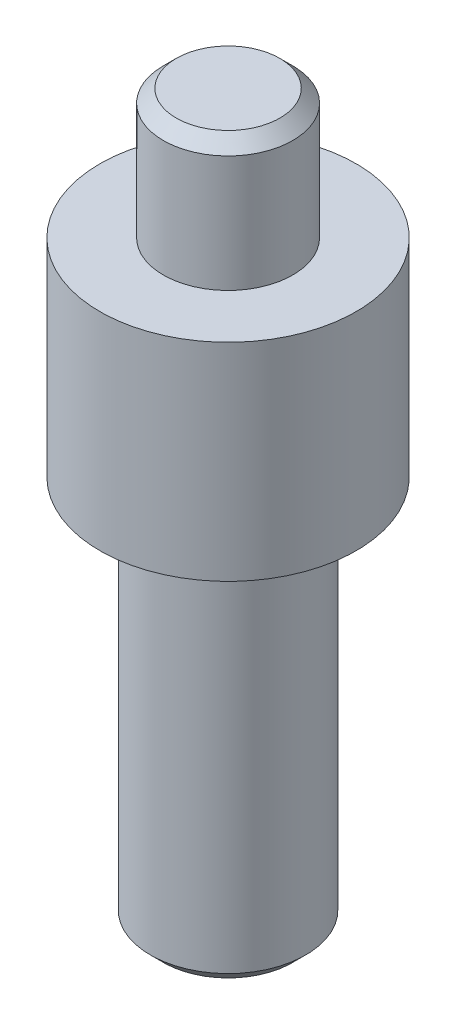
ISO-10303-21;
HEADER;
FILE_DESCRIPTION(('STEP AP214'),'2;1');
FILE_NAME('part.step','',(''),(''),'','','');
FILE_SCHEMA(('AUTOMOTIVE_DESIGN { 1 0 10303 214 1 1 1 1 }'));
ENDSEC;
DATA;
#1=APPLICATION_CONTEXT('core data for automotive mechanical design processes');
#2=APPLICATION_PROTOCOL_DEFINITION('international standard','automotive_design',2000,#1);
#3=PRODUCT_CONTEXT('',#1,'mechanical');
#4=PRODUCT('Part','Part','',(#3));
#5=PRODUCT_RELATED_PRODUCT_CATEGORY('part','',(#4));
#6=PRODUCT_DEFINITION_FORMATION('','',#4);
#7=PRODUCT_DEFINITION_CONTEXT('part definition',#1,'design');
#8=PRODUCT_DEFINITION('design','',#6,#7);
#9=PRODUCT_DEFINITION_SHAPE('','',#8);
#10=(LENGTH_UNIT() NAMED_UNIT(*) SI_UNIT(.MILLI.,.METRE.));
#11=(NAMED_UNIT(*) PLANE_ANGLE_UNIT() SI_UNIT($,.RADIAN.));
#12=(NAMED_UNIT(*) SI_UNIT($,.STERADIAN.) SOLID_ANGLE_UNIT());
#13=UNCERTAINTY_MEASURE_WITH_UNIT(LENGTH_MEASURE(1.E-05),#10,'distance_accuracy_value','');
#14=(GEOMETRIC_REPRESENTATION_CONTEXT(3) GLOBAL_UNCERTAINTY_ASSIGNED_CONTEXT((#13)) GLOBAL_UNIT_ASSIGNED_CONTEXT((#10,
#11,#12)) REPRESENTATION_CONTEXT('',''));
#15=CARTESIAN_POINT('',(0.,0.,0.));
#16=DIRECTION('',(0.,0.,1.));
#17=DIRECTION('',(1.,0.,0.));
#18=AXIS2_PLACEMENT_3D('',#15,#16,#17);
#19=CARTESIAN_POINT('',(0.,8.,0.));
#20=DIRECTION('',(0.,1.,0.));
#21=DIRECTION('',(-1.,0.,0.));
#22=AXIS2_PLACEMENT_3D('',#19,#20,#21);
#23=PLANE('',#22);
#24=CARTESIAN_POINT('',(0.,8.,0.));
#25=DIRECTION('',(0.,1.,0.));
#26=DIRECTION('',(-1.,0.,0.));
#27=AXIS2_PLACEMENT_3D('',#24,#25,#26);
#28=CIRCLE('',#27,4.95);
#29=CARTESIAN_POINT('',(-4.95,8.,0.));
#30=VERTEX_POINT('',#29);
#31=EDGE_CURVE('E58',#30,#30,#28,.T.);
#32=ORIENTED_EDGE('',*,*,#31,.T.);
#33=EDGE_LOOP('',(#32));
#34=FACE_BOUND('',#33,.T.);
#35=CARTESIAN_POINT('',(0.,8.,0.));
#36=DIRECTION('',(0.,1.,0.));
#37=DIRECTION('',(-1.,0.,0.));
#38=AXIS2_PLACEMENT_3D('',#35,#36,#37);
#39=CIRCLE('',#38,2.5);
#40=CARTESIAN_POINT('',(-2.50000000000001,8.,0.));
#41=VERTEX_POINT('',#40);
#42=EDGE_CURVE('E62',#41,#41,#39,.T.);
#43=ORIENTED_EDGE('',*,*,#42,.F.);
#44=EDGE_LOOP('',(#43));
#45=FACE_BOUND('',#44,.T.);
#46=ADVANCED_FACE('F35',(#34,#45),#23,.T.);
#47=CARTESIAN_POINT('',(0.,-15.,0.));
#48=DIRECTION('',(0.,1.,0.));
#49=DIRECTION('',(-1.,0.,0.));
#50=AXIS2_PLACEMENT_3D('',#47,#48,#49);
#51=CYLINDRICAL_SURFACE('',#50,3.);
#52=CARTESIAN_POINT('',(0.,-14.5,0.));
#53=DIRECTION('',(0.,1.,0.));
#54=DIRECTION('',(-1.,0.,0.));
#55=AXIS2_PLACEMENT_3D('',#52,#53,#54);
#56=CIRCLE('',#55,3.);
#57=CARTESIAN_POINT('',(-3.,-14.5,0.));
#58=VERTEX_POINT('',#57);
#59=EDGE_CURVE('E50',#58,#58,#56,.T.);
#60=ORIENTED_EDGE('',*,*,#59,.T.);
#61=EDGE_LOOP('',(#60));
#62=FACE_BOUND('',#61,.T.);
#63=CARTESIAN_POINT('',(0.,0.,0.));
#64=DIRECTION('',(0.,1.,0.));
#65=DIRECTION('',(-1.,0.,0.));
#66=AXIS2_PLACEMENT_3D('',#63,#64,#65);
#67=CIRCLE('',#66,3.);
#68=CARTESIAN_POINT('',(-3.,0.,0.));
#69=VERTEX_POINT('',#68);
#70=EDGE_CURVE('E55',#69,#69,#67,.T.);
#71=ORIENTED_EDGE('',*,*,#70,.F.);
#72=EDGE_LOOP('',(#71));
#73=FACE_BOUND('',#72,.T.);
#74=ADVANCED_FACE('F71',(#62,#73),#51,.T.);
#75=CARTESIAN_POINT('',(0.,-15.,0.));
#76=DIRECTION('',(0.,1.,0.));
#77=DIRECTION('',(-1.,0.,0.));
#78=AXIS2_PLACEMENT_3D('',#75,#76,#77);
#79=PLANE('',#78);
#80=CARTESIAN_POINT('',(0.,-15.,0.));
#81=DIRECTION('',(0.,1.,0.));
#82=DIRECTION('',(-1.,0.,0.));
#83=AXIS2_PLACEMENT_3D('',#80,#81,#82);
#84=CIRCLE('',#83,2.5);
#85=CARTESIAN_POINT('',(-2.5,-15.,0.));
#86=VERTEX_POINT('',#85);
#87=EDGE_CURVE('E46',#86,#86,#84,.F.);
#88=ORIENTED_EDGE('',*,*,#87,.T.);
#89=EDGE_LOOP('',(#88));
#90=FACE_BOUND('',#89,.T.);
#91=ADVANCED_FACE('F77',(#90),#79,.F.);
#92=CARTESIAN_POINT('',(0.,8.,0.));
#93=DIRECTION('',(0.,-1.,0.));
#94=DIRECTION('',(1.,0.,0.));
#95=AXIS2_PLACEMENT_3D('',#92,#93,#94);
#96=CYLINDRICAL_SURFACE('',#95,4.95);
#97=ORIENTED_EDGE('',*,*,#31,.F.);
#98=EDGE_LOOP('',(#97));
#99=FACE_BOUND('',#98,.T.);
#100=CARTESIAN_POINT('',(0.,0.,0.));
#101=DIRECTION('',(0.,1.,0.));
#102=DIRECTION('',(-1.,0.,0.));
#103=AXIS2_PLACEMENT_3D('',#100,#101,#102);
#104=CIRCLE('',#103,4.95);
#105=CARTESIAN_POINT('',(-4.95,0.,0.));
#106=VERTEX_POINT('',#105);
#107=EDGE_CURVE('E59',#106,#106,#104,.T.);
#108=ORIENTED_EDGE('',*,*,#107,.T.);
#109=EDGE_LOOP('',(#108));
#110=FACE_BOUND('',#109,.T.);
#111=ADVANCED_FACE('F87',(#99,#110),#96,.T.);
#112=CARTESIAN_POINT('',(0.,0.,0.));
#113=DIRECTION('',(0.,1.,0.));
#114=DIRECTION('',(-1.,0.,0.));
#115=AXIS2_PLACEMENT_3D('',#112,#113,#114);
#116=PLANE('',#115);
#117=ORIENTED_EDGE('',*,*,#70,.T.);
#118=EDGE_LOOP('',(#117));
#119=FACE_BOUND('',#118,.T.);
#120=ORIENTED_EDGE('',*,*,#107,.F.);
#121=EDGE_LOOP('',(#120));
#122=FACE_BOUND('',#121,.T.);
#123=ADVANCED_FACE('F83',(#119,#122),#116,.F.);
#124=CARTESIAN_POINT('',(0.,-14.5,0.));
#125=DIRECTION('',(0.,1.,0.));
#126=DIRECTION('',(-1.,0.,0.));
#127=AXIS2_PLACEMENT_3D('',#124,#125,#126);
#128=CONICAL_SURFACE('',#127,3.,0.785398163397452);
#129=ORIENTED_EDGE('',*,*,#87,.F.);
#130=EDGE_LOOP('',(#129));
#131=FACE_BOUND('',#130,.T.);
#132=ORIENTED_EDGE('',*,*,#59,.F.);
#133=EDGE_LOOP('',(#132));
#134=FACE_BOUND('',#133,.T.);
#135=ADVANCED_FACE('F86',(#131,#134),#128,.T.);
#136=CARTESIAN_POINT('',(0.,13.,0.));
#137=DIRECTION('',(0.,-1.,0.));
#138=DIRECTION('',(1.,0.,0.));
#139=AXIS2_PLACEMENT_3D('',#136,#137,#138);
#140=CYLINDRICAL_SURFACE('',#139,2.5);
#141=CARTESIAN_POINT('',(0.,12.5,0.));
#142=DIRECTION('',(0.,1.,0.));
#143=DIRECTION('',(-1.,0.,0.));
#144=AXIS2_PLACEMENT_3D('',#141,#142,#143);
#145=CIRCLE('',#144,2.5);
#146=CARTESIAN_POINT('',(-2.50000000000001,12.5,0.));
#147=VERTEX_POINT('',#146);
#148=EDGE_CURVE('E10',#147,#147,#145,.F.);
#149=ORIENTED_EDGE('',*,*,#148,.T.);
#150=EDGE_LOOP('',(#149));
#151=FACE_BOUND('',#150,.T.);
#152=ORIENTED_EDGE('',*,*,#42,.T.);
#153=EDGE_LOOP('',(#152));
#154=FACE_BOUND('',#153,.T.);
#155=ADVANCED_FACE('F68',(#151,#154),#140,.T.);
#156=CARTESIAN_POINT('',(0.,13.,0.));
#157=DIRECTION('',(0.,1.,0.));
#158=DIRECTION('',(-1.,0.,0.));
#159=AXIS2_PLACEMENT_3D('',#156,#157,#158);
#160=PLANE('',#159);
#161=CARTESIAN_POINT('',(0.,13.,0.));
#162=DIRECTION('',(0.,1.,0.));
#163=DIRECTION('',(-1.,0.,0.));
#164=AXIS2_PLACEMENT_3D('',#161,#162,#163);
#165=CIRCLE('',#164,2.);
#166=CARTESIAN_POINT('',(-2.00000000000001,13.,0.));
#167=VERTEX_POINT('',#166);
#168=EDGE_CURVE('E42',#167,#167,#165,.T.);
#169=ORIENTED_EDGE('',*,*,#168,.T.);
#170=EDGE_LOOP('',(#169));
#171=FACE_BOUND('',#170,.T.);
#172=ADVANCED_FACE('F99',(#171),#160,.T.);
#173=CARTESIAN_POINT('',(0.,13.,0.));
#174=DIRECTION('',(0.,-1.,0.));
#175=DIRECTION('',(1.,0.,0.));
#176=AXIS2_PLACEMENT_3D('',#173,#174,#175);
#177=CONICAL_SURFACE('',#176,2.,0.785398163397448);
#178=ORIENTED_EDGE('',*,*,#148,.F.);
#179=EDGE_LOOP('',(#178));
#180=FACE_BOUND('',#179,.T.);
#181=ORIENTED_EDGE('',*,*,#168,.F.);
#182=EDGE_LOOP('',(#181));
#183=FACE_BOUND('',#182,.T.);
#184=ADVANCED_FACE('F37',(#180,#183),#177,.T.);
#185=CLOSED_SHELL('',(#46,#74,#91,#111,#123,#135,#155,#172,#184));
#186=MANIFOLD_SOLID_BREP('B2',#185);
#187=ADVANCED_BREP_SHAPE_REPRESENTATION('',(#18,#186),#14);
#188=SHAPE_DEFINITION_REPRESENTATION(#9,#187);
ENDSEC;
END-ISO-10303-21;
